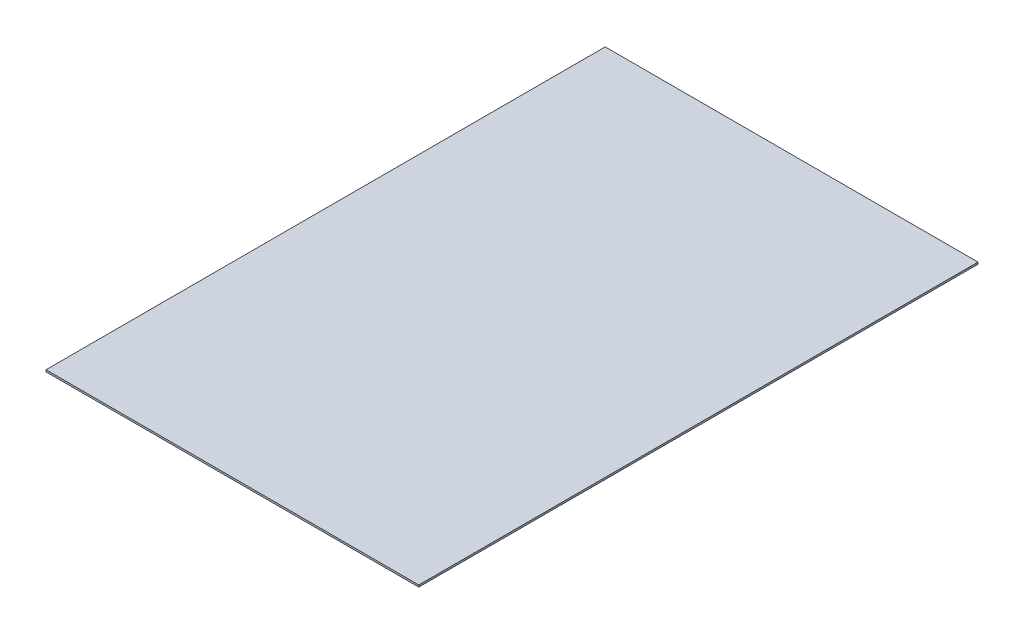
ISO-10303-21;
HEADER;
FILE_DESCRIPTION(('STEP AP214'),'2;1');
FILE_NAME('part.step','',(''),(''),'','','');
FILE_SCHEMA(('AUTOMOTIVE_DESIGN { 1 0 10303 214 1 1 1 1 }'));
ENDSEC;
DATA;
#1=APPLICATION_CONTEXT('core data for automotive mechanical design processes');
#2=APPLICATION_PROTOCOL_DEFINITION('international standard','automotive_design',2000,#1);
#3=PRODUCT_CONTEXT('',#1,'mechanical');
#4=PRODUCT('Part','Part','',(#3));
#5=PRODUCT_RELATED_PRODUCT_CATEGORY('part','',(#4));
#6=PRODUCT_DEFINITION_FORMATION('','',#4);
#7=PRODUCT_DEFINITION_CONTEXT('part definition',#1,'design');
#8=PRODUCT_DEFINITION('design','',#6,#7);
#9=PRODUCT_DEFINITION_SHAPE('','',#8);
#10=(LENGTH_UNIT() NAMED_UNIT(*) SI_UNIT(.MILLI.,.METRE.));
#11=(NAMED_UNIT(*) PLANE_ANGLE_UNIT() SI_UNIT($,.RADIAN.));
#12=(NAMED_UNIT(*) SI_UNIT($,.STERADIAN.) SOLID_ANGLE_UNIT());
#13=UNCERTAINTY_MEASURE_WITH_UNIT(LENGTH_MEASURE(1.E-05),#10,'distance_accuracy_value','');
#14=(GEOMETRIC_REPRESENTATION_CONTEXT(3) GLOBAL_UNCERTAINTY_ASSIGNED_CONTEXT((#13)) GLOBAL_UNIT_ASSIGNED_CONTEXT((#10,
#11,#12)) REPRESENTATION_CONTEXT('',''));
#15=CARTESIAN_POINT('',(0.,0.,0.));
#16=DIRECTION('',(0.,0.,1.));
#17=DIRECTION('',(1.,0.,0.));
#18=AXIS2_PLACEMENT_3D('',#15,#16,#17);
#19=CARTESIAN_POINT('',(100.,1.,150.));
#20=DIRECTION('',(-1.,0.,0.));
#21=DIRECTION('',(0.,0.,1.));
#22=AXIS2_PLACEMENT_3D('',#19,#20,#21);
#23=PLANE('',#22);
#24=DIRECTION('',(0.,0.,-1.));
#25=VECTOR('',#24,1.);
#26=CARTESIAN_POINT('',(100.,0.,150.));
#27=LINE('',#26,#25);
#28=CARTESIAN_POINT('',(100.,0.,150.));
#29=VERTEX_POINT('',#28);
#30=CARTESIAN_POINT('',(100.,0.,-150.));
#31=VERTEX_POINT('',#30);
#32=EDGE_CURVE('E96',#29,#31,#27,.T.);
#33=ORIENTED_EDGE('',*,*,#32,.T.);
#34=DIRECTION('',(0.,-1.,0.));
#35=VECTOR('',#34,1.);
#36=CARTESIAN_POINT('',(100.,1.,-150.));
#37=LINE('',#36,#35);
#38=CARTESIAN_POINT('',(100.,1.,-150.));
#39=VERTEX_POINT('',#38);
#40=EDGE_CURVE('E11',#39,#31,#37,.T.);
#41=ORIENTED_EDGE('',*,*,#40,.F.);
#42=DIRECTION('',(0.,0.,-1.));
#43=VECTOR('',#42,1.);
#44=CARTESIAN_POINT('',(100.,1.,150.));
#45=LINE('',#44,#43);
#46=CARTESIAN_POINT('',(100.,1.,150.));
#47=VERTEX_POINT('',#46);
#48=EDGE_CURVE('E84',#47,#39,#45,.T.);
#49=ORIENTED_EDGE('',*,*,#48,.F.);
#50=DIRECTION('',(0.,-1.,0.));
#51=VECTOR('',#50,1.);
#52=CARTESIAN_POINT('',(100.,1.,150.));
#53=LINE('',#52,#51);
#54=EDGE_CURVE('E92',#47,#29,#53,.T.);
#55=ORIENTED_EDGE('',*,*,#54,.T.);
#56=EDGE_LOOP('',(#33,#41,#49,#55));
#57=FACE_BOUND('',#56,.T.);
#58=ADVANCED_FACE('F33',(#57),#23,.F.);
#59=CARTESIAN_POINT('',(-100.,1.,-150.));
#60=DIRECTION('',(0.,0.,1.));
#61=DIRECTION('',(1.,0.,0.));
#62=AXIS2_PLACEMENT_3D('',#59,#60,#61);
#63=PLANE('',#62);
#64=DIRECTION('',(-1.,0.,0.));
#65=VECTOR('',#64,1.);
#66=CARTESIAN_POINT('',(-100.,0.,-150.));
#67=LINE('',#66,#65);
#68=CARTESIAN_POINT('',(-100.,0.,-150.));
#69=VERTEX_POINT('',#68);
#70=EDGE_CURVE('E88',#31,#69,#67,.T.);
#71=ORIENTED_EDGE('',*,*,#70,.T.);
#72=DIRECTION('',(0.,-1.,0.));
#73=VECTOR('',#72,1.);
#74=CARTESIAN_POINT('',(-100.,1.,-150.));
#75=LINE('',#74,#73);
#76=CARTESIAN_POINT('',(-100.,1.,-150.));
#77=VERTEX_POINT('',#76);
#78=EDGE_CURVE('E41',#77,#69,#75,.T.);
#79=ORIENTED_EDGE('',*,*,#78,.F.);
#80=DIRECTION('',(-1.,0.,0.));
#81=VECTOR('',#80,1.);
#82=CARTESIAN_POINT('',(-100.,1.,-150.));
#83=LINE('',#82,#81);
#84=EDGE_CURVE('E79',#39,#77,#83,.T.);
#85=ORIENTED_EDGE('',*,*,#84,.F.);
#86=ORIENTED_EDGE('',*,*,#40,.T.);
#87=EDGE_LOOP('',(#71,#79,#85,#86));
#88=FACE_BOUND('',#87,.T.);
#89=ADVANCED_FACE('F87',(#88),#63,.F.);
#90=CARTESIAN_POINT('',(-100.,1.,150.));
#91=DIRECTION('',(1.,0.,0.));
#92=DIRECTION('',(0.,0.,-1.));
#93=AXIS2_PLACEMENT_3D('',#90,#91,#92);
#94=PLANE('',#93);
#95=DIRECTION('',(0.,0.,1.));
#96=VECTOR('',#95,1.);
#97=CARTESIAN_POINT('',(-100.,0.,150.));
#98=LINE('',#97,#96);
#99=CARTESIAN_POINT('',(-100.,0.,150.));
#100=VERTEX_POINT('',#99);
#101=EDGE_CURVE('E66',#69,#100,#98,.T.);
#102=ORIENTED_EDGE('',*,*,#101,.T.);
#103=DIRECTION('',(0.,-1.,0.));
#104=VECTOR('',#103,1.);
#105=CARTESIAN_POINT('',(-100.,1.,150.));
#106=LINE('',#105,#104);
#107=CARTESIAN_POINT('',(-100.,1.,150.));
#108=VERTEX_POINT('',#107);
#109=EDGE_CURVE('E89',#108,#100,#106,.T.);
#110=ORIENTED_EDGE('',*,*,#109,.F.);
#111=DIRECTION('',(0.,0.,1.));
#112=VECTOR('',#111,1.);
#113=CARTESIAN_POINT('',(-100.,1.,150.));
#114=LINE('',#113,#112);
#115=EDGE_CURVE('E82',#77,#108,#114,.T.);
#116=ORIENTED_EDGE('',*,*,#115,.F.);
#117=ORIENTED_EDGE('',*,*,#78,.T.);
#118=EDGE_LOOP('',(#102,#110,#116,#117));
#119=FACE_BOUND('',#118,.T.);
#120=ADVANCED_FACE('F90',(#119),#94,.F.);
#121=CARTESIAN_POINT('',(-100.,1.,150.));
#122=DIRECTION('',(0.,0.,-1.));
#123=DIRECTION('',(-1.,0.,0.));
#124=AXIS2_PLACEMENT_3D('',#121,#122,#123);
#125=PLANE('',#124);
#126=DIRECTION('',(1.,0.,0.));
#127=VECTOR('',#126,1.);
#128=CARTESIAN_POINT('',(-100.,0.,150.));
#129=LINE('',#128,#127);
#130=EDGE_CURVE('E72',#100,#29,#129,.T.);
#131=ORIENTED_EDGE('',*,*,#130,.T.);
#132=ORIENTED_EDGE('',*,*,#54,.F.);
#133=DIRECTION('',(1.,0.,0.));
#134=VECTOR('',#133,1.);
#135=CARTESIAN_POINT('',(-100.,1.,150.));
#136=LINE('',#135,#134);
#137=EDGE_CURVE('E49',#108,#47,#136,.T.);
#138=ORIENTED_EDGE('',*,*,#137,.F.);
#139=ORIENTED_EDGE('',*,*,#109,.T.);
#140=EDGE_LOOP('',(#131,#132,#138,#139));
#141=FACE_BOUND('',#140,.T.);
#142=ADVANCED_FACE('F103',(#141),#125,.F.);
#143=CARTESIAN_POINT('',(0.,1.,0.));
#144=DIRECTION('',(0.,-1.,0.));
#145=DIRECTION('',(0.,0.,-1.));
#146=AXIS2_PLACEMENT_3D('',#143,#144,#145);
#147=PLANE('',#146);
#148=ORIENTED_EDGE('',*,*,#48,.T.);
#149=ORIENTED_EDGE('',*,*,#84,.T.);
#150=ORIENTED_EDGE('',*,*,#115,.T.);
#151=ORIENTED_EDGE('',*,*,#137,.T.);
#152=EDGE_LOOP('',(#148,#149,#150,#151));
#153=FACE_BOUND('',#152,.T.);
#154=ADVANCED_FACE('F80',(#153),#147,.F.);
#155=CARTESIAN_POINT('',(0.,0.,0.));
#156=DIRECTION('',(0.,-1.,0.));
#157=DIRECTION('',(0.,0.,-1.));
#158=AXIS2_PLACEMENT_3D('',#155,#156,#157);
#159=PLANE('',#158);
#160=ORIENTED_EDGE('',*,*,#32,.F.);
#161=ORIENTED_EDGE('',*,*,#130,.F.);
#162=ORIENTED_EDGE('',*,*,#101,.F.);
#163=ORIENTED_EDGE('',*,*,#70,.F.);
#164=EDGE_LOOP('',(#160,#161,#162,#163));
#165=FACE_BOUND('',#164,.T.);
#166=ADVANCED_FACE('F106',(#165),#159,.T.);
#167=CLOSED_SHELL('',(#58,#89,#120,#142,#154,#166));
#168=MANIFOLD_SOLID_BREP('B2',#167);
#169=ADVANCED_BREP_SHAPE_REPRESENTATION('',(#18,#168),#14);
#170=SHAPE_DEFINITION_REPRESENTATION(#9,#169);
ENDSEC;
END-ISO-10303-21;
